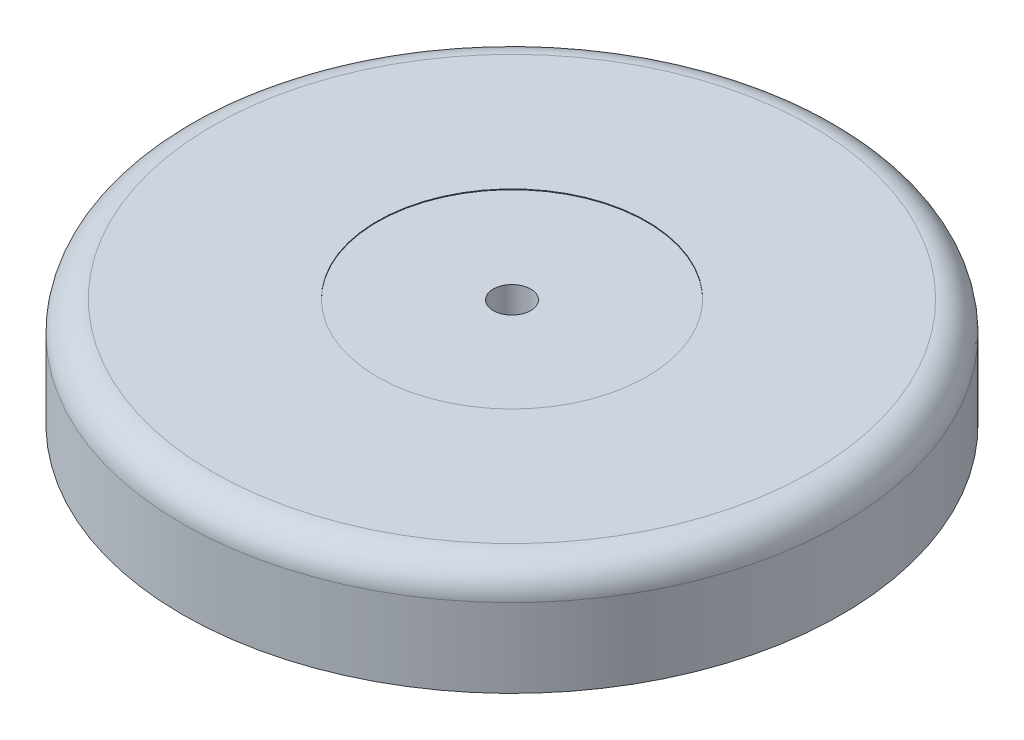
ISO-10303-21;
HEADER;
FILE_DESCRIPTION(('STEP AP214'),'2;1');
FILE_NAME('part.step','',(''),(''),'','','');
FILE_SCHEMA(('AUTOMOTIVE_DESIGN { 1 0 10303 214 1 1 1 1 }'));
ENDSEC;
DATA;
#1=APPLICATION_CONTEXT('core data for automotive mechanical design processes');
#2=APPLICATION_PROTOCOL_DEFINITION('international standard','automotive_design',2000,#1);
#3=PRODUCT_CONTEXT('',#1,'mechanical');
#4=PRODUCT('Part','Part','',(#3));
#5=PRODUCT_RELATED_PRODUCT_CATEGORY('part','',(#4));
#6=PRODUCT_DEFINITION_FORMATION('','',#4);
#7=PRODUCT_DEFINITION_CONTEXT('part definition',#1,'design');
#8=PRODUCT_DEFINITION('design','',#6,#7);
#9=PRODUCT_DEFINITION_SHAPE('','',#8);
#10=(LENGTH_UNIT() NAMED_UNIT(*) SI_UNIT(.MILLI.,.METRE.));
#11=(NAMED_UNIT(*) PLANE_ANGLE_UNIT() SI_UNIT($,.RADIAN.));
#12=(NAMED_UNIT(*) SI_UNIT($,.STERADIAN.) SOLID_ANGLE_UNIT());
#13=UNCERTAINTY_MEASURE_WITH_UNIT(LENGTH_MEASURE(1.E-05),#10,'distance_accuracy_value','');
#14=(GEOMETRIC_REPRESENTATION_CONTEXT(3) GLOBAL_UNCERTAINTY_ASSIGNED_CONTEXT((#13)) GLOBAL_UNIT_ASSIGNED_CONTEXT((#10,
#11,#12)) REPRESENTATION_CONTEXT('',''));
#15=CARTESIAN_POINT('',(0.,0.,0.));
#16=DIRECTION('',(0.,0.,1.));
#17=DIRECTION('',(1.,0.,0.));
#18=AXIS2_PLACEMENT_3D('',#15,#16,#17);
#19=CARTESIAN_POINT('',(0.,14.5,0.));
#20=DIRECTION('',(0.,-1.,0.));
#21=DIRECTION('',(0.,0.,-1.));
#22=AXIS2_PLACEMENT_3D('',#19,#20,#21);
#23=CYLINDRICAL_SURFACE('',#22,44.);
#24=CARTESIAN_POINT('',(0.,10.5,0.));
#25=DIRECTION('',(0.,1.,0.));
#26=DIRECTION('',(0.,0.,1.));
#27=AXIS2_PLACEMENT_3D('',#24,#25,#26);
#28=CIRCLE('',#27,44.);
#29=CARTESIAN_POINT('',(0.,10.5,-44.));
#30=VERTEX_POINT('',#29);
#31=EDGE_CURVE('E11',#30,#30,#28,.F.);
#32=CARTESIAN_POINT('',(0.,0.,0.));
#33=DIRECTION('',(0.,1.,0.));
#34=DIRECTION('',(0.,0.,1.));
#35=AXIS2_PLACEMENT_3D('',#32,#33,#34);
#36=CIRCLE('',#35,44.);
#37=CARTESIAN_POINT('',(0.,0.,-44.));
#38=VERTEX_POINT('',#37);
#39=EDGE_CURVE('E58',#38,#38,#36,.T.);
#40=CARTESIAN_POINT('',(0.,10.5,-44.));
#41=CARTESIAN_POINT('',(0.,10.390625,-44.));
#42=CARTESIAN_POINT('',(0.,10.28125,-44.));
#43=CARTESIAN_POINT('',(0.,10.0625,-44.));
#44=CARTESIAN_POINT('',(0.,9.953125,-44.));
#45=CARTESIAN_POINT('',(0.,9.734375,-44.));
#46=CARTESIAN_POINT('',(0.,9.625,-44.));
#47=CARTESIAN_POINT('',(0.,9.40625,-44.));
#48=CARTESIAN_POINT('',(0.,9.296875,-44.));
#49=CARTESIAN_POINT('',(0.,9.078125,-44.));
#50=CARTESIAN_POINT('',(0.,8.96875,-44.));
#51=CARTESIAN_POINT('',(0.,8.75,-44.));
#52=CARTESIAN_POINT('',(0.,8.640625,-44.));
#53=CARTESIAN_POINT('',(0.,8.421875,-44.));
#54=CARTESIAN_POINT('',(0.,8.3125,-44.));
#55=CARTESIAN_POINT('',(0.,8.09375,-44.));
#56=CARTESIAN_POINT('',(0.,7.984375,-44.));
#57=CARTESIAN_POINT('',(0.,7.765625,-44.));
#58=CARTESIAN_POINT('',(0.,7.65625,-44.));
#59=CARTESIAN_POINT('',(0.,7.4375,-44.));
#60=CARTESIAN_POINT('',(0.,7.328125,-44.));
#61=CARTESIAN_POINT('',(0.,7.109375,-44.));
#62=CARTESIAN_POINT('',(0.,7.,-44.));
#63=CARTESIAN_POINT('',(0.,6.78125,-44.));
#64=CARTESIAN_POINT('',(0.,6.671875,-44.));
#65=CARTESIAN_POINT('',(0.,6.453125,-44.));
#66=CARTESIAN_POINT('',(0.,6.34375,-44.));
#67=CARTESIAN_POINT('',(0.,6.125,-44.));
#68=CARTESIAN_POINT('',(0.,6.015625,-44.));
#69=CARTESIAN_POINT('',(0.,5.796875,-44.));
#70=CARTESIAN_POINT('',(0.,5.6875,-44.));
#71=CARTESIAN_POINT('',(0.,5.46875,-44.));
#72=CARTESIAN_POINT('',(0.,5.359375,-44.));
#73=CARTESIAN_POINT('',(0.,5.140625,-44.));
#74=CARTESIAN_POINT('',(0.,5.03125,-44.));
#75=CARTESIAN_POINT('',(0.,4.8125,-44.));
#76=CARTESIAN_POINT('',(0.,4.703125,-44.));
#77=CARTESIAN_POINT('',(0.,4.484375,-44.));
#78=CARTESIAN_POINT('',(0.,4.375,-44.));
#79=CARTESIAN_POINT('',(0.,4.15625,-44.));
#80=CARTESIAN_POINT('',(0.,4.046875,-44.));
#81=CARTESIAN_POINT('',(0.,3.828125,-44.));
#82=CARTESIAN_POINT('',(0.,3.71875,-44.));
#83=CARTESIAN_POINT('',(0.,3.5,-44.));
#84=CARTESIAN_POINT('',(0.,3.390625,-44.));
#85=CARTESIAN_POINT('',(0.,3.171875,-44.));
#86=CARTESIAN_POINT('',(0.,3.0625,-44.));
#87=CARTESIAN_POINT('',(0.,2.84375,-44.));
#88=CARTESIAN_POINT('',(0.,2.734375,-44.));
#89=CARTESIAN_POINT('',(0.,2.515625,-44.));
#90=CARTESIAN_POINT('',(0.,2.40625,-44.));
#91=CARTESIAN_POINT('',(0.,2.1875,-44.));
#92=CARTESIAN_POINT('',(0.,2.078125,-44.));
#93=CARTESIAN_POINT('',(0.,1.859375,-44.));
#94=CARTESIAN_POINT('',(0.,1.75,-44.));
#95=CARTESIAN_POINT('',(0.,1.53125,-44.));
#96=CARTESIAN_POINT('',(0.,1.421875,-44.));
#97=CARTESIAN_POINT('',(0.,1.203125,-44.));
#98=CARTESIAN_POINT('',(0.,1.09375,-44.));
#99=CARTESIAN_POINT('',(0.,0.875000000000001,-44.));
#100=CARTESIAN_POINT('',(0.,0.765625000000001,-44.));
#101=CARTESIAN_POINT('',(0.,0.546875,-44.));
#102=CARTESIAN_POINT('',(0.,0.4375,-44.));
#103=CARTESIAN_POINT('',(0.,0.21875,-44.));
#104=CARTESIAN_POINT('',(0.,0.109375,-44.));
#105=CARTESIAN_POINT('',(0.,0.,-44.));
#106=B_SPLINE_CURVE_WITH_KNOTS('',3,(#40,#41,#42,#43,#44,#45,#46,#47,#48,#49,#50,#51,#52,#53,
#54,#55,#56,#57,#58,#59,#60,#61,#62,#63,#64,#65,#66,#67,#68,#69,#70,#71,#72,#73,#74,#75,#76,#77,
#78,#79,#80,#81,#82,#83,#84,#85,#86,#87,#88,#89,#90,#91,#92,#93,#94,#95,#96,#97,#98,#99,#100,
#101,#102,#103,#104,#105),.UNSPECIFIED.,.F.,.F.,(4,2,2,2,2,2,2,2,2,2,2,2,2,2,2,2,2,2,2,2,2,2,2,
2,2,2,2,2,2,2,2,2,4),(0.,0.328124999999999,0.656249999999999,0.984374999999999,1.3125,1.640625,
1.96875,2.296875,2.625,2.953125,3.28125,3.609375,3.9375,4.265625,4.59375,4.921875,5.25,5.578125,
5.90625,6.234375,6.5625,6.890625,7.21875,7.546875,7.875,8.203125,8.53125,8.859375,9.1875,
9.515625,9.84375,10.171875,10.5),.UNSPECIFIED.);
#107=EDGE_CURVE('BSEAM45',#30,#38,#106,.T.);
#108=ORIENTED_EDGE('',*,*,#31,.T.);
#109=ORIENTED_EDGE('',*,*,#39,.T.);
#110=ORIENTED_EDGE('',*,*,#107,.T.);
#111=ORIENTED_EDGE('',*,*,#107,.F.);
#112=EDGE_LOOP('',(#108,#110,#109,#111));
#113=FACE_BOUND('',#112,.T.);
#114=ADVANCED_FACE('F45',(#113),#23,.T.);
#115=CARTESIAN_POINT('',(0.,14.5,0.));
#116=DIRECTION('',(0.,1.,0.));
#117=DIRECTION('',(0.,0.,1.));
#118=AXIS2_PLACEMENT_3D('',#115,#116,#117);
#119=PLANE('',#118);
#120=CARTESIAN_POINT('',(0.,14.5,0.));
#121=DIRECTION('',(0.,1.,0.));
#122=DIRECTION('',(0.,0.,1.));
#123=AXIS2_PLACEMENT_3D('',#120,#121,#122);
#124=CIRCLE('',#123,18.);
#125=CARTESIAN_POINT('',(0.,14.5,18.));
#126=VERTEX_POINT('',#125);
#127=EDGE_CURVE('E66',#126,#126,#124,.T.);
#128=ORIENTED_EDGE('',*,*,#127,.F.);
#129=EDGE_LOOP('',(#128));
#130=FACE_BOUND('',#129,.T.);
#131=CARTESIAN_POINT('',(0.,14.5,0.));
#132=DIRECTION('',(0.,1.,0.));
#133=DIRECTION('',(0.,0.,1.));
#134=AXIS2_PLACEMENT_3D('',#131,#132,#133);
#135=CIRCLE('',#134,40.);
#136=CARTESIAN_POINT('',(0.,14.5,40.));
#137=VERTEX_POINT('',#136);
#138=EDGE_CURVE('E53',#137,#137,#135,.T.);
#139=ORIENTED_EDGE('',*,*,#138,.T.);
#140=EDGE_LOOP('',(#139));
#141=FACE_BOUND('',#140,.T.);
#142=ADVANCED_FACE('F116',(#130,#141),#119,.T.);
#143=CARTESIAN_POINT('',(0.,0.,0.));
#144=DIRECTION('',(0.,1.,0.));
#145=DIRECTION('',(0.,0.,1.));
#146=AXIS2_PLACEMENT_3D('',#143,#144,#145);
#147=PLANE('',#146);
#148=CARTESIAN_POINT('',(0.,0.,0.));
#149=DIRECTION('',(0.,-1.,0.));
#150=DIRECTION('',(0.,0.,-1.));
#151=AXIS2_PLACEMENT_3D('',#148,#149,#150);
#152=CIRCLE('',#151,18.);
#153=CARTESIAN_POINT('',(0.,0.,-18.));
#154=VERTEX_POINT('',#153);
#155=EDGE_CURVE('E86',#154,#154,#152,.T.);
#156=ORIENTED_EDGE('',*,*,#155,.F.);
#157=EDGE_LOOP('',(#156));
#158=FACE_BOUND('',#157,.T.);
#159=ORIENTED_EDGE('',*,*,#39,.F.);
#160=EDGE_LOOP('',(#159));
#161=FACE_BOUND('',#160,.T.);
#162=ADVANCED_FACE('F113',(#158,#161),#147,.F.);
#163=CARTESIAN_POINT('',(0.,10.5,0.));
#164=DIRECTION('',(0.,1.,0.));
#165=DIRECTION('',(0.,0.,1.));
#166=AXIS2_PLACEMENT_3D('',#163,#164,#165);
#167=TOROIDAL_SURFACE('',#166,40.,4.);
#168=ORIENTED_EDGE('',*,*,#31,.F.);
#169=EDGE_LOOP('',(#168));
#170=FACE_BOUND('',#169,.T.);
#171=ORIENTED_EDGE('',*,*,#138,.F.);
#172=EDGE_LOOP('',(#171));
#173=FACE_BOUND('',#172,.T.);
#174=ADVANCED_FACE('F47',(#170,#173),#167,.T.);
#175=CARTESIAN_POINT('',(0.,14.4,0.));
#176=DIRECTION('',(0.,1.,0.));
#177=DIRECTION('',(0.,0.,1.));
#178=AXIS2_PLACEMENT_3D('',#175,#176,#177);
#179=CYLINDRICAL_SURFACE('',#178,18.);
#180=CARTESIAN_POINT('',(0.,14.4,0.));
#181=DIRECTION('',(0.,1.,0.));
#182=DIRECTION('',(0.,0.,1.));
#183=AXIS2_PLACEMENT_3D('',#180,#181,#182);
#184=CIRCLE('',#183,18.);
#185=CARTESIAN_POINT('',(0.,14.4,18.));
#186=VERTEX_POINT('',#185);
#187=EDGE_CURVE('E63',#186,#186,#184,.T.);
#188=ORIENTED_EDGE('',*,*,#187,.F.);
#189=EDGE_LOOP('',(#188));
#190=FACE_BOUND('',#189,.T.);
#191=ORIENTED_EDGE('',*,*,#127,.T.);
#192=EDGE_LOOP('',(#191));
#193=FACE_BOUND('',#192,.T.);
#194=ADVANCED_FACE('F127',(#190,#193),#179,.F.);
#195=CARTESIAN_POINT('',(0.,14.4,0.));
#196=DIRECTION('',(0.,1.,0.));
#197=DIRECTION('',(0.,0.,1.));
#198=AXIS2_PLACEMENT_3D('',#195,#196,#197);
#199=PLANE('',#198);
#200=CARTESIAN_POINT('',(0.,14.4,0.));
#201=DIRECTION('',(0.,1.,0.));
#202=DIRECTION('',(0.,0.,1.));
#203=AXIS2_PLACEMENT_3D('',#200,#201,#202);
#204=CIRCLE('',#203,2.5);
#205=CARTESIAN_POINT('',(0.,14.4,2.5));
#206=VERTEX_POINT('',#205);
#207=EDGE_CURVE('E70',#206,#206,#204,.T.);
#208=ORIENTED_EDGE('',*,*,#207,.F.);
#209=EDGE_LOOP('',(#208));
#210=FACE_BOUND('',#209,.T.);
#211=ORIENTED_EDGE('',*,*,#187,.T.);
#212=EDGE_LOOP('',(#211));
#213=FACE_BOUND('',#212,.T.);
#214=ADVANCED_FACE('F130',(#210,#213),#199,.T.);
#215=CARTESIAN_POINT('',(0.,0.,0.));
#216=DIRECTION('',(0.,1.,0.));
#217=DIRECTION('',(0.,0.,1.));
#218=AXIS2_PLACEMENT_3D('',#215,#216,#217);
#219=CYLINDRICAL_SURFACE('',#218,2.5);
#220=ORIENTED_EDGE('',*,*,#207,.T.);
#221=EDGE_LOOP('',(#220));
#222=FACE_BOUND('',#221,.T.);
#223=CARTESIAN_POINT('',(0.,-9.3,0.));
#224=DIRECTION('',(0.,-1.,0.));
#225=DIRECTION('',(0.,0.,-1.));
#226=AXIS2_PLACEMENT_3D('',#223,#224,#225);
#227=CIRCLE('',#226,2.5);
#228=CARTESIAN_POINT('',(0.,-9.3,-2.5));
#229=VERTEX_POINT('',#228);
#230=EDGE_CURVE('E81',#229,#229,#227,.F.);
#231=ORIENTED_EDGE('',*,*,#230,.F.);
#232=EDGE_LOOP('',(#231));
#233=FACE_BOUND('',#232,.T.);
#234=ADVANCED_FACE('F134',(#222,#233),#219,.F.);
#235=CARTESIAN_POINT('',(0.,-9.3,0.));
#236=DIRECTION('',(0.,1.,0.));
#237=DIRECTION('',(0.,0.,1.));
#238=AXIS2_PLACEMENT_3D('',#235,#236,#237);
#239=CYLINDRICAL_SURFACE('',#238,7.5);
#240=CARTESIAN_POINT('',(0.,-9.3,0.));
#241=DIRECTION('',(0.,-1.,0.));
#242=DIRECTION('',(0.,0.,-1.));
#243=AXIS2_PLACEMENT_3D('',#240,#241,#242);
#244=CIRCLE('',#243,7.5);
#245=CARTESIAN_POINT('',(0.,-9.3,-7.5));
#246=VERTEX_POINT('',#245);
#247=EDGE_CURVE('E77',#246,#246,#244,.T.);
#248=ORIENTED_EDGE('',*,*,#247,.F.);
#249=EDGE_LOOP('',(#248));
#250=FACE_BOUND('',#249,.T.);
#251=CARTESIAN_POINT('',(0.,0.1,0.));
#252=DIRECTION('',(0.,-1.,0.));
#253=DIRECTION('',(0.,0.,-1.));
#254=AXIS2_PLACEMENT_3D('',#251,#252,#253);
#255=CIRCLE('',#254,7.5);
#256=CARTESIAN_POINT('',(0.,0.1,-7.5));
#257=VERTEX_POINT('',#256);
#258=EDGE_CURVE('E90',#257,#257,#255,.T.);
#259=ORIENTED_EDGE('',*,*,#258,.T.);
#260=EDGE_LOOP('',(#259));
#261=FACE_BOUND('',#260,.T.);
#262=ADVANCED_FACE('F98',(#250,#261),#239,.T.);
#263=CARTESIAN_POINT('',(0.,-9.3,0.));
#264=DIRECTION('',(0.,-1.,0.));
#265=DIRECTION('',(0.,0.,-1.));
#266=AXIS2_PLACEMENT_3D('',#263,#264,#265);
#267=PLANE('',#266);
#268=ORIENTED_EDGE('',*,*,#230,.T.);
#269=EDGE_LOOP('',(#268));
#270=FACE_BOUND('',#269,.T.);
#271=ORIENTED_EDGE('',*,*,#247,.T.);
#272=EDGE_LOOP('',(#271));
#273=FACE_BOUND('',#272,.T.);
#274=ADVANCED_FACE('F109',(#270,#273),#267,.T.);
#275=CARTESIAN_POINT('',(0.,0.1,0.));
#276=DIRECTION('',(0.,-1.,0.));
#277=DIRECTION('',(0.,0.,-1.));
#278=AXIS2_PLACEMENT_3D('',#275,#276,#277);
#279=CYLINDRICAL_SURFACE('',#278,18.);
#280=CARTESIAN_POINT('',(0.,0.1,0.));
#281=DIRECTION('',(0.,-1.,0.));
#282=DIRECTION('',(0.,0.,-1.));
#283=AXIS2_PLACEMENT_3D('',#280,#281,#282);
#284=CIRCLE('',#283,18.);
#285=CARTESIAN_POINT('',(0.,0.1,-18.));
#286=VERTEX_POINT('',#285);
#287=EDGE_CURVE('E85',#286,#286,#284,.T.);
#288=ORIENTED_EDGE('',*,*,#287,.F.);
#289=EDGE_LOOP('',(#288));
#290=FACE_BOUND('',#289,.T.);
#291=ORIENTED_EDGE('',*,*,#155,.T.);
#292=EDGE_LOOP('',(#291));
#293=FACE_BOUND('',#292,.T.);
#294=ADVANCED_FACE('F103',(#290,#293),#279,.F.);
#295=CARTESIAN_POINT('',(0.,0.1,0.));
#296=DIRECTION('',(0.,-1.,0.));
#297=DIRECTION('',(0.,0.,-1.));
#298=AXIS2_PLACEMENT_3D('',#295,#296,#297);
#299=PLANE('',#298);
#300=ORIENTED_EDGE('',*,*,#258,.F.);
#301=EDGE_LOOP('',(#300));
#302=FACE_BOUND('',#301,.T.);
#303=ORIENTED_EDGE('',*,*,#287,.T.);
#304=EDGE_LOOP('',(#303));
#305=FACE_BOUND('',#304,.T.);
#306=ADVANCED_FACE('F100',(#302,#305),#299,.T.);
#307=CLOSED_SHELL('',(#114,#142,#162,#174,#194,#214,#234,#262,#274,#294,#306));
#308=MANIFOLD_SOLID_BREP('B2',#307);
#309=ADVANCED_BREP_SHAPE_REPRESENTATION('',(#18,#308),#14);
#310=SHAPE_DEFINITION_REPRESENTATION(#9,#309);
ENDSEC;
END-ISO-10303-21;
